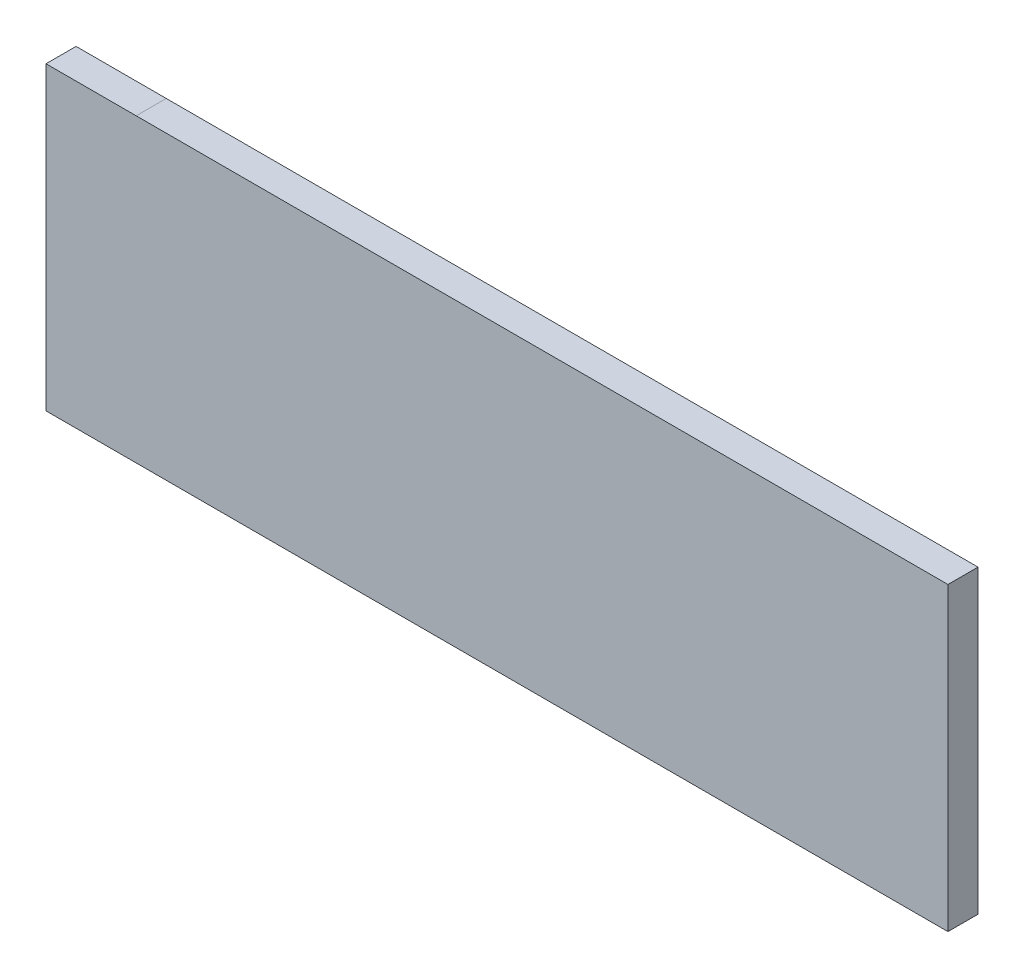
ISO-10303-21;
HEADER;
FILE_DESCRIPTION(('STEP AP214'),'2;1');
FILE_NAME('part.step','',(''),(''),'','','');
FILE_SCHEMA(('AUTOMOTIVE_DESIGN { 1 0 10303 214 1 1 1 1 }'));
ENDSEC;
DATA;
#1=APPLICATION_CONTEXT('core data for automotive mechanical design processes');
#2=APPLICATION_PROTOCOL_DEFINITION('international standard','automotive_design',2000,#1);
#3=PRODUCT_CONTEXT('',#1,'mechanical');
#4=PRODUCT('Part','Part','',(#3));
#5=PRODUCT_RELATED_PRODUCT_CATEGORY('part','',(#4));
#6=PRODUCT_DEFINITION_FORMATION('','',#4);
#7=PRODUCT_DEFINITION_CONTEXT('part definition',#1,'design');
#8=PRODUCT_DEFINITION('design','',#6,#7);
#9=PRODUCT_DEFINITION_SHAPE('','',#8);
#10=(LENGTH_UNIT() NAMED_UNIT(*) SI_UNIT(.MILLI.,.METRE.));
#11=(NAMED_UNIT(*) PLANE_ANGLE_UNIT() SI_UNIT($,.RADIAN.));
#12=(NAMED_UNIT(*) SI_UNIT($,.STERADIAN.) SOLID_ANGLE_UNIT());
#13=UNCERTAINTY_MEASURE_WITH_UNIT(LENGTH_MEASURE(1.E-05),#10,'distance_accuracy_value','');
#14=(GEOMETRIC_REPRESENTATION_CONTEXT(3) GLOBAL_UNCERTAINTY_ASSIGNED_CONTEXT((#13)) GLOBAL_UNIT_ASSIGNED_CONTEXT((#10,
#11,#12)) REPRESENTATION_CONTEXT('',''));
#15=CARTESIAN_POINT('',(0.,0.,0.));
#16=DIRECTION('',(0.,0.,1.));
#17=DIRECTION('',(1.,0.,0.));
#18=AXIS2_PLACEMENT_3D('',#15,#16,#17);
#19=CARTESIAN_POINT('',(0.,0.,100.));
#20=DIRECTION('',(0.,1.,0.));
#21=DIRECTION('',(0.,0.,1.));
#22=AXIS2_PLACEMENT_3D('',#19,#20,#21);
#23=PLANE('',#22);
#24=DIRECTION('',(0.,0.,-1.));
#25=VECTOR('',#24,1.);
#26=CARTESIAN_POINT('',(2700.,0.,100.));
#27=LINE('',#26,#25);
#28=CARTESIAN_POINT('',(2700.,0.,100.));
#29=VERTEX_POINT('',#28);
#30=CARTESIAN_POINT('',(2700.,0.,0.));
#31=VERTEX_POINT('',#30);
#32=EDGE_CURVE('E11',#29,#31,#27,.T.);
#33=ORIENTED_EDGE('',*,*,#32,.F.);
#34=DIRECTION('',(1.,0.,0.));
#35=VECTOR('',#34,1.);
#36=CARTESIAN_POINT('',(0.,0.,100.));
#37=LINE('',#36,#35);
#38=CARTESIAN_POINT('',(0.,0.,100.));
#39=VERTEX_POINT('',#38);
#40=EDGE_CURVE('E90',#39,#29,#37,.T.);
#41=ORIENTED_EDGE('',*,*,#40,.F.);
#42=DIRECTION('',(0.,0.,-1.));
#43=VECTOR('',#42,1.);
#44=CARTESIAN_POINT('',(0.,0.,100.));
#45=LINE('',#44,#43);
#46=CARTESIAN_POINT('',(0.,0.,0.));
#47=VERTEX_POINT('',#46);
#48=EDGE_CURVE('E93',#39,#47,#45,.T.);
#49=ORIENTED_EDGE('',*,*,#48,.T.);
#50=DIRECTION('',(1.,0.,0.));
#51=VECTOR('',#50,1.);
#52=CARTESIAN_POINT('',(0.,0.,0.));
#53=LINE('',#52,#51);
#54=EDGE_CURVE('E129',#47,#31,#53,.T.);
#55=ORIENTED_EDGE('',*,*,#54,.T.);
#56=EDGE_LOOP('',(#33,#41,#49,#55));
#57=FACE_BOUND('',#56,.T.);
#58=ADVANCED_FACE('F41',(#57),#23,.F.);
#59=CARTESIAN_POINT('',(0.,1000.,100.));
#60=DIRECTION('',(0.,-1.,0.));
#61=DIRECTION('',(0.,0.,-1.));
#62=AXIS2_PLACEMENT_3D('',#59,#60,#61);
#63=PLANE('',#62);
#64=DIRECTION('',(0.,0.,1.));
#65=VECTOR('',#64,1.);
#66=CARTESIAN_POINT('',(300.,1000.,99.9999999999995));
#67=LINE('',#66,#65);
#68=CARTESIAN_POINT('',(300.,1000.,0.));
#69=VERTEX_POINT('',#68);
#70=CARTESIAN_POINT('',(300.,1000.,100.));
#71=VERTEX_POINT('',#70);
#72=EDGE_CURVE('E50',#69,#71,#67,.T.);
#73=ORIENTED_EDGE('',*,*,#72,.F.);
#74=DIRECTION('',(-1.,0.,0.));
#75=VECTOR('',#74,1.);
#76=CARTESIAN_POINT('',(0.,1000.,0.));
#77=LINE('',#76,#75);
#78=CARTESIAN_POINT('',(0.,1000.,0.));
#79=VERTEX_POINT('',#78);
#80=EDGE_CURVE('E126',#69,#79,#77,.T.);
#81=ORIENTED_EDGE('',*,*,#80,.T.);
#82=DIRECTION('',(0.,0.,-1.));
#83=VECTOR('',#82,1.);
#84=CARTESIAN_POINT('',(0.,1000.,100.));
#85=LINE('',#84,#83);
#86=CARTESIAN_POINT('',(0.,1000.,100.));
#87=VERTEX_POINT('',#86);
#88=EDGE_CURVE('E121',#87,#79,#85,.T.);
#89=ORIENTED_EDGE('',*,*,#88,.F.);
#90=DIRECTION('',(-1.,0.,0.));
#91=VECTOR('',#90,1.);
#92=CARTESIAN_POINT('',(0.,1000.,100.));
#93=LINE('',#92,#91);
#94=EDGE_CURVE('E104',#71,#87,#93,.T.);
#95=ORIENTED_EDGE('',*,*,#94,.F.);
#96=EDGE_LOOP('',(#73,#81,#89,#95));
#97=FACE_BOUND('',#96,.T.);
#98=ADVANCED_FACE('F146',(#97),#63,.F.);
#99=CARTESIAN_POINT('',(0.,0.,100.));
#100=DIRECTION('',(1.,0.,0.));
#101=DIRECTION('',(0.,0.,-1.));
#102=AXIS2_PLACEMENT_3D('',#99,#100,#101);
#103=PLANE('',#102);
#104=DIRECTION('',(0.,-1.,0.));
#105=VECTOR('',#104,1.);
#106=CARTESIAN_POINT('',(0.,0.,0.));
#107=LINE('',#106,#105);
#108=EDGE_CURVE('E111',#79,#47,#107,.T.);
#109=ORIENTED_EDGE('',*,*,#108,.T.);
#110=ORIENTED_EDGE('',*,*,#48,.F.);
#111=DIRECTION('',(0.,-1.,0.));
#112=VECTOR('',#111,1.);
#113=CARTESIAN_POINT('',(0.,0.,100.));
#114=LINE('',#113,#112);
#115=EDGE_CURVE('E100',#87,#39,#114,.T.);
#116=ORIENTED_EDGE('',*,*,#115,.F.);
#117=ORIENTED_EDGE('',*,*,#88,.T.);
#118=EDGE_LOOP('',(#109,#110,#116,#117));
#119=FACE_BOUND('',#118,.T.);
#120=ADVANCED_FACE('F43',(#119),#103,.F.);
#121=CARTESIAN_POINT('',(3000.,0.,100.));
#122=VERTEX_POINT('',#121);
#123=EDGE_CURVE('E97',#29,#122,#37,.T.);
#124=ORIENTED_EDGE('',*,*,#123,.F.);
#125=ORIENTED_EDGE('',*,*,#32,.T.);
#126=CARTESIAN_POINT('',(3000.,0.,0.));
#127=VERTEX_POINT('',#126);
#128=EDGE_CURVE('E131',#31,#127,#53,.T.);
#129=ORIENTED_EDGE('',*,*,#128,.T.);
#130=DIRECTION('',(0.,0.,-1.));
#131=VECTOR('',#130,1.);
#132=CARTESIAN_POINT('',(3000.,0.,100.));
#133=LINE('',#132,#131);
#134=EDGE_CURVE('E112',#122,#127,#133,.T.);
#135=ORIENTED_EDGE('',*,*,#134,.F.);
#136=EDGE_LOOP('',(#124,#125,#129,#135));
#137=FACE_BOUND('',#136,.T.);
#138=ADVANCED_FACE('F149',(#137),#23,.F.);
#139=CARTESIAN_POINT('',(3000.,0.,100.));
#140=DIRECTION('',(-1.,0.,0.));
#141=DIRECTION('',(0.,0.,1.));
#142=AXIS2_PLACEMENT_3D('',#139,#140,#141);
#143=PLANE('',#142);
#144=DIRECTION('',(0.,1.,0.));
#145=VECTOR('',#144,1.);
#146=CARTESIAN_POINT('',(3000.,0.,0.));
#147=LINE('',#146,#145);
#148=CARTESIAN_POINT('',(3000.,1000.,0.));
#149=VERTEX_POINT('',#148);
#150=EDGE_CURVE('E127',#127,#149,#147,.T.);
#151=ORIENTED_EDGE('',*,*,#150,.T.);
#152=DIRECTION('',(0.,0.,-1.));
#153=VECTOR('',#152,1.);
#154=CARTESIAN_POINT('',(3000.,1000.,100.));
#155=LINE('',#154,#153);
#156=CARTESIAN_POINT('',(3000.,1000.,100.));
#157=VERTEX_POINT('',#156);
#158=EDGE_CURVE('E116',#157,#149,#155,.T.);
#159=ORIENTED_EDGE('',*,*,#158,.F.);
#160=DIRECTION('',(0.,1.,0.));
#161=VECTOR('',#160,1.);
#162=CARTESIAN_POINT('',(3000.,0.,100.));
#163=LINE('',#162,#161);
#164=EDGE_CURVE('E96',#122,#157,#163,.T.);
#165=ORIENTED_EDGE('',*,*,#164,.F.);
#166=ORIENTED_EDGE('',*,*,#134,.T.);
#167=EDGE_LOOP('',(#151,#159,#165,#166));
#168=FACE_BOUND('',#167,.T.);
#169=ADVANCED_FACE('F139',(#168),#143,.F.);
#170=EDGE_CURVE('E108',#149,#69,#77,.T.);
#171=ORIENTED_EDGE('',*,*,#170,.T.);
#172=ORIENTED_EDGE('',*,*,#72,.T.);
#173=EDGE_CURVE('E123',#157,#71,#93,.T.);
#174=ORIENTED_EDGE('',*,*,#173,.F.);
#175=ORIENTED_EDGE('',*,*,#158,.T.);
#176=EDGE_LOOP('',(#171,#172,#174,#175));
#177=FACE_BOUND('',#176,.T.);
#178=ADVANCED_FACE('F143',(#177),#63,.F.);
#179=CARTESIAN_POINT('',(0.,1000.,100.));
#180=DIRECTION('',(0.,0.,-1.));
#181=DIRECTION('',(-1.,0.,0.));
#182=AXIS2_PLACEMENT_3D('',#179,#180,#181);
#183=PLANE('',#182);
#184=ORIENTED_EDGE('',*,*,#115,.T.);
#185=ORIENTED_EDGE('',*,*,#40,.T.);
#186=ORIENTED_EDGE('',*,*,#123,.T.);
#187=ORIENTED_EDGE('',*,*,#164,.T.);
#188=ORIENTED_EDGE('',*,*,#173,.T.);
#189=ORIENTED_EDGE('',*,*,#94,.T.);
#190=EDGE_LOOP('',(#184,#185,#186,#187,#188,#189));
#191=FACE_BOUND('',#190,.T.);
#192=ADVANCED_FACE('F101',(#191),#183,.F.);
#193=CARTESIAN_POINT('',(0.,1000.,0.));
#194=DIRECTION('',(0.,0.,-1.));
#195=DIRECTION('',(-1.,0.,0.));
#196=AXIS2_PLACEMENT_3D('',#193,#194,#195);
#197=PLANE('',#196);
#198=ORIENTED_EDGE('',*,*,#108,.F.);
#199=ORIENTED_EDGE('',*,*,#80,.F.);
#200=ORIENTED_EDGE('',*,*,#170,.F.);
#201=ORIENTED_EDGE('',*,*,#150,.F.);
#202=ORIENTED_EDGE('',*,*,#128,.F.);
#203=ORIENTED_EDGE('',*,*,#54,.F.);
#204=EDGE_LOOP('',(#198,#199,#200,#201,#202,#203));
#205=FACE_BOUND('',#204,.T.);
#206=ADVANCED_FACE('F148',(#205),#197,.T.);
#207=CLOSED_SHELL('',(#58,#98,#120,#138,#169,#178,#192,#206));
#208=MANIFOLD_SOLID_BREP('B2',#207);
#209=ADVANCED_BREP_SHAPE_REPRESENTATION('',(#18,#208),#14);
#210=SHAPE_DEFINITION_REPRESENTATION(#9,#209);
ENDSEC;
END-ISO-10303-21;
